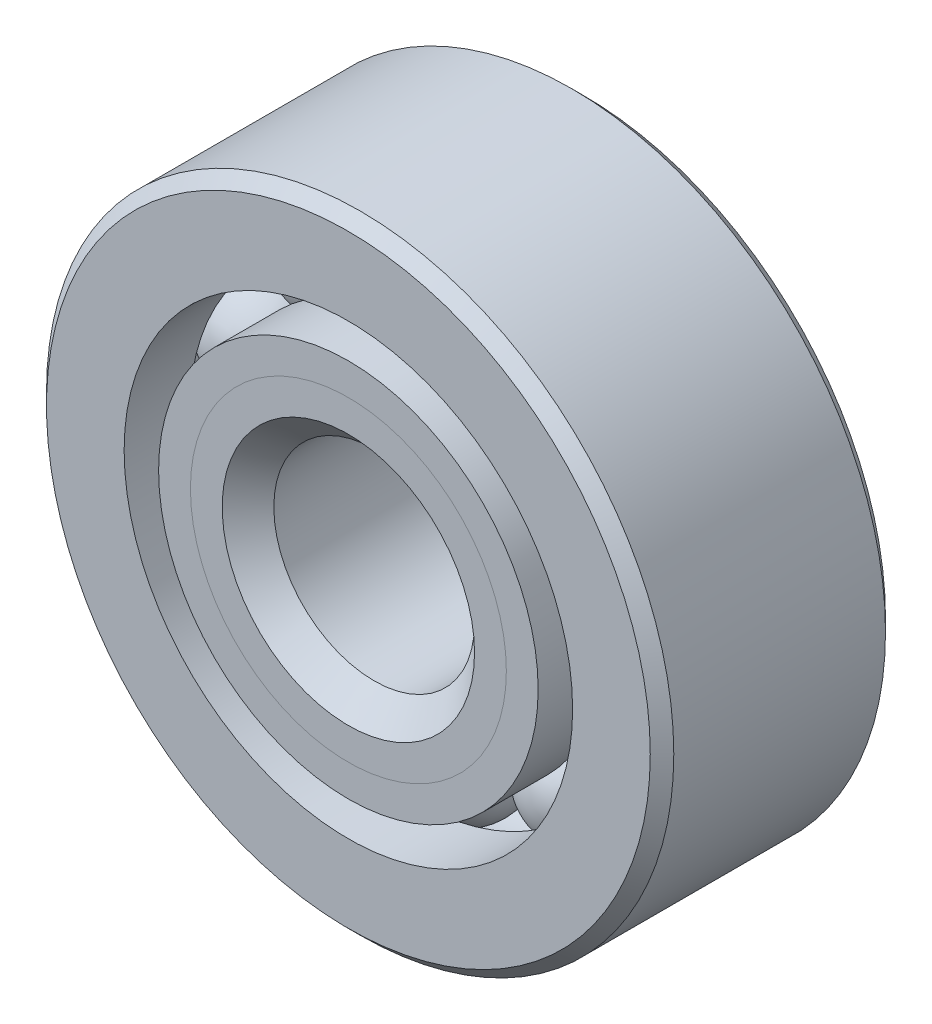
ISO-10303-21;
HEADER;
FILE_DESCRIPTION(('STEP AP214'),'2;1');
FILE_NAME('part.step','',(''),(''),'','','');
FILE_SCHEMA(('AUTOMOTIVE_DESIGN { 1 0 10303 214 1 1 1 1 }'));
ENDSEC;
DATA;
#1=APPLICATION_CONTEXT('core data for automotive mechanical design processes');
#2=APPLICATION_PROTOCOL_DEFINITION('international standard','automotive_design',2000,#1);
#3=PRODUCT_CONTEXT('',#1,'mechanical');
#4=PRODUCT('Part','Part','',(#3));
#5=PRODUCT_RELATED_PRODUCT_CATEGORY('part','',(#4));
#6=PRODUCT_DEFINITION_FORMATION('','',#4);
#7=PRODUCT_DEFINITION_CONTEXT('part definition',#1,'design');
#8=PRODUCT_DEFINITION('design','',#6,#7);
#9=PRODUCT_DEFINITION_SHAPE('','',#8);
#10=(LENGTH_UNIT() NAMED_UNIT(*) SI_UNIT(.MILLI.,.METRE.));
#11=(NAMED_UNIT(*) PLANE_ANGLE_UNIT() SI_UNIT($,.RADIAN.));
#12=(NAMED_UNIT(*) SI_UNIT($,.STERADIAN.) SOLID_ANGLE_UNIT());
#13=UNCERTAINTY_MEASURE_WITH_UNIT(LENGTH_MEASURE(1.E-05),#10,'distance_accuracy_value','');
#14=(GEOMETRIC_REPRESENTATION_CONTEXT(3) GLOBAL_UNCERTAINTY_ASSIGNED_CONTEXT((#13)) GLOBAL_UNIT_ASSIGNED_CONTEXT((#10,
#11,#12)) REPRESENTATION_CONTEXT('',''));
#15=CARTESIAN_POINT('',(0.,0.,0.));
#16=DIRECTION('',(0.,0.,1.));
#17=DIRECTION('',(1.,0.,0.));
#18=AXIS2_PLACEMENT_3D('',#15,#16,#17);
#19=CARTESIAN_POINT('',(-0.615851998089428,0.847647555856359,0.));
#20=DIRECTION('',(0.,0.,1.));
#21=DIRECTION('',(-0.587785252292462,0.809016994374955,0.));
#22=AXIS2_PLACEMENT_3D('',#19,#20,#21);
#23=SPHERICAL_SURFACE('',#22,0.278590360257991);
#24=CARTESIAN_POINT('',(-0.615851998089428,0.847647555856359,0.27859036025799));
#25=VERTEX_POINT('',#24);
#26=VERTEX_LOOP('',#25);
#27=FACE_BOUND('',#26,.T.);
#28=ADVANCED_FACE('F54',(#27),#23,.T.);
#29=CLOSED_SHELL('',(#28));
#30=MANIFOLD_SOLID_BREP('B2',#29);
#31=CARTESIAN_POINT('',(-0.996469464948244,0.323772555856362,0.));
#32=DIRECTION('',(0.,0.,1.));
#33=DIRECTION('',(-0.95105651629515,0.309016994374958,0.));
#34=AXIS2_PLACEMENT_3D('',#31,#32,#33);
#35=SPHERICAL_SURFACE('',#34,0.278590360257991);
#36=CARTESIAN_POINT('',(-0.996469464948244,0.323772555856362,0.27859036025799));
#37=VERTEX_POINT('',#36);
#38=VERTEX_LOOP('',#37);
#39=FACE_BOUND('',#38,.T.);
#40=ADVANCED_FACE('F94',(#39),#35,.T.);
#41=CLOSED_SHELL('',(#40));
#42=MANIFOLD_SOLID_BREP('B6',#41);
#43=CARTESIAN_POINT('',(-0.99646946494825,-0.323772555856342,0.));
#44=DIRECTION('',(0.,0.,1.));
#45=DIRECTION('',(-0.951056516295157,-0.309016994374938,0.));
#46=AXIS2_PLACEMENT_3D('',#43,#44,#45);
#47=SPHERICAL_SURFACE('',#46,0.278590360257991);
#48=CARTESIAN_POINT('',(-0.99646946494825,-0.323772555856342,0.27859036025799));
#49=VERTEX_POINT('',#48);
#50=VERTEX_LOOP('',#49);
#51=FACE_BOUND('',#50,.T.);
#52=ADVANCED_FACE('F134',(#51),#47,.T.);
#53=CLOSED_SHELL('',(#52));
#54=MANIFOLD_SOLID_BREP('B50',#53);
#55=CARTESIAN_POINT('',(-0.615851998089446,-0.847647555856346,0.));
#56=DIRECTION('',(0.,0.,1.));
#57=DIRECTION('',(-0.58778525229248,-0.809016994374942,0.));
#58=AXIS2_PLACEMENT_3D('',#55,#56,#57);
#59=SPHERICAL_SURFACE('',#58,0.278590360257991);
#60=CARTESIAN_POINT('',(-0.615851998089446,-0.847647555856346,0.27859036025799));
#61=VERTEX_POINT('',#60);
#62=VERTEX_LOOP('',#61);
#63=FACE_BOUND('',#62,.T.);
#64=ADVANCED_FACE('F174',(#63),#59,.T.);
#65=CLOSED_SHELL('',(#64));
#66=MANIFOLD_SOLID_BREP('B90',#65);
#67=CARTESIAN_POINT('',(0.,-1.04775,0.));
#68=DIRECTION('',(0.,0.,1.));
#69=DIRECTION('',(0.,-1.,0.));
#70=AXIS2_PLACEMENT_3D('',#67,#68,#69);
#71=SPHERICAL_SURFACE('',#70,0.278590360257991);
#72=CARTESIAN_POINT('',(0.,-1.04775,0.27859036025799));
#73=VERTEX_POINT('',#72);
#74=VERTEX_LOOP('',#73);
#75=FACE_BOUND('',#74,.T.);
#76=ADVANCED_FACE('F214',(#75),#71,.T.);
#77=CLOSED_SHELL('',(#76));
#78=MANIFOLD_SOLID_BREP('B130',#77);
#79=CARTESIAN_POINT('',(0.615851998089434,-0.847647555856355,0.));
#80=DIRECTION('',(0.,0.,1.));
#81=DIRECTION('',(0.587785252292469,-0.809016994374951,0.));
#82=AXIS2_PLACEMENT_3D('',#79,#80,#81);
#83=SPHERICAL_SURFACE('',#82,0.278590360257991);
#84=CARTESIAN_POINT('',(0.615851998089434,-0.847647555856355,0.27859036025799));
#85=VERTEX_POINT('',#84);
#86=VERTEX_LOOP('',#85);
#87=FACE_BOUND('',#86,.T.);
#88=ADVANCED_FACE('F254',(#87),#83,.T.);
#89=CLOSED_SHELL('',(#88));
#90=MANIFOLD_SOLID_BREP('B170',#89);
#91=CARTESIAN_POINT('',(0.996469464948246,-0.323772555856356,0.));
#92=DIRECTION('',(0.,0.,1.));
#93=DIRECTION('',(0.951056516295152,-0.309016994374952,0.));
#94=AXIS2_PLACEMENT_3D('',#91,#92,#93);
#95=SPHERICAL_SURFACE('',#94,0.278590360257991);
#96=CARTESIAN_POINT('',(0.996469464948246,-0.323772555856356,0.27859036025799));
#97=VERTEX_POINT('',#96);
#98=VERTEX_LOOP('',#97);
#99=FACE_BOUND('',#98,.T.);
#100=ADVANCED_FACE('F294',(#99),#95,.T.);
#101=CLOSED_SHELL('',(#100));
#102=MANIFOLD_SOLID_BREP('B210',#101);
#103=CARTESIAN_POINT('',(0.996469464948248,0.323772555856348,0.));
#104=DIRECTION('',(0.,0.,1.));
#105=DIRECTION('',(0.951056516295155,0.309016994374945,0.));
#106=AXIS2_PLACEMENT_3D('',#103,#104,#105);
#107=SPHERICAL_SURFACE('',#106,0.278590360257991);
#108=CARTESIAN_POINT('',(0.996469464948248,0.323772555856348,0.27859036025799));
#109=VERTEX_POINT('',#108);
#110=VERTEX_LOOP('',#109);
#111=FACE_BOUND('',#110,.T.);
#112=ADVANCED_FACE('F334',(#111),#107,.T.);
#113=CLOSED_SHELL('',(#112));
#114=MANIFOLD_SOLID_BREP('B250',#113);
#115=CARTESIAN_POINT('',(0.61585199808944,0.847647555856351,0.));
#116=DIRECTION('',(0.,0.,1.));
#117=DIRECTION('',(0.587785252292474,0.809016994374947,0.));
#118=AXIS2_PLACEMENT_3D('',#115,#116,#117);
#119=SPHERICAL_SURFACE('',#118,0.278590360257991);
#120=CARTESIAN_POINT('',(0.61585199808944,0.847647555856351,0.27859036025799));
#121=VERTEX_POINT('',#120);
#122=VERTEX_LOOP('',#121);
#123=FACE_BOUND('',#122,.T.);
#124=ADVANCED_FACE('F374',(#123),#119,.T.);
#125=CLOSED_SHELL('',(#124));
#126=MANIFOLD_SOLID_BREP('B290',#125);
#127=CARTESIAN_POINT('',(0.,1.04775,0.));
#128=DIRECTION('',(0.,0.,1.));
#129=DIRECTION('',(0.,1.,0.));
#130=AXIS2_PLACEMENT_3D('',#127,#128,#129);
#131=SPHERICAL_SURFACE('',#130,0.278590360257991);
#132=CARTESIAN_POINT('',(0.,1.04775,0.27859036025799));
#133=VERTEX_POINT('',#132);
#134=VERTEX_LOOP('',#133);
#135=FACE_BOUND('',#134,.T.);
#136=ADVANCED_FACE('F416',(#135),#131,.T.);
#137=CLOSED_SHELL('',(#136));
#138=MANIFOLD_SOLID_BREP('B330',#137);
#139=CARTESIAN_POINT('',(0.,0.799552272572866,0.5953125));
#140=DIRECTION('',(0.,0.,-1.));
#141=DIRECTION('',(-1.,0.,0.));
#142=AXIS2_PLACEMENT_3D('',#139,#140,#141);
#143=PLANE('',#142);
#144=CARTESIAN_POINT('',(0.,0.,0.5953125));
#145=DIRECTION('',(0.,0.,1.));
#146=DIRECTION('',(1.,0.,0.));
#147=AXIS2_PLACEMENT_3D('',#144,#145,#146);
#148=CIRCLE('',#147,0.638579819871005);
#149=CARTESIAN_POINT('',(0.638579819871005,0.,0.5953125));
#150=VERTEX_POINT('',#149);
#151=EDGE_CURVE('E482',#150,#150,#148,.T.);
#152=ORIENTED_EDGE('',*,*,#151,.F.);
#153=EDGE_LOOP('',(#152));
#154=FACE_BOUND('',#153,.T.);
#155=CARTESIAN_POINT('',(0.,0.,0.5953125));
#156=DIRECTION('',(0.,0.,1.));
#157=DIRECTION('',(1.,0.,0.));
#158=AXIS2_PLACEMENT_3D('',#155,#156,#157);
#159=CIRCLE('',#158,0.799552272572866);
#160=CARTESIAN_POINT('',(0.799552272572866,0.,0.5953125));
#161=VERTEX_POINT('',#160);
#162=EDGE_CURVE('E415',#161,#161,#159,.T.);
#163=ORIENTED_EDGE('',*,*,#162,.T.);
#164=EDGE_LOOP('',(#163));
#165=FACE_BOUND('',#164,.T.);
#166=ADVANCED_FACE('F437',(#154,#165),#143,.F.);
#167=CARTESIAN_POINT('',(0.,0.,0.43434004729814));
#168=DIRECTION('',(0.,0.,1.));
#169=DIRECTION('',(1.,0.,0.));
#170=AXIS2_PLACEMENT_3D('',#167,#168,#169);
#171=CONICAL_SURFACE('',#170,0.638579819871005,0.78539816339745);
#172=ORIENTED_EDGE('',*,*,#162,.F.);
#173=EDGE_LOOP('',(#172));
#174=FACE_BOUND('',#173,.T.);
#175=CARTESIAN_POINT('',(0.,0.,0.43434004729814));
#176=DIRECTION('',(0.,0.,1.));
#177=DIRECTION('',(1.,0.,0.));
#178=AXIS2_PLACEMENT_3D('',#175,#176,#177);
#179=CIRCLE('',#178,0.638579819871005);
#180=CARTESIAN_POINT('',(0.638579819871005,0.,0.43434004729814));
#181=VERTEX_POINT('',#180);
#182=EDGE_CURVE('E444',#181,#181,#179,.T.);
#183=ORIENTED_EDGE('',*,*,#182,.T.);
#184=EDGE_LOOP('',(#183));
#185=FACE_BOUND('',#184,.T.);
#186=ADVANCED_FACE('F491',(#174,#185),#171,.T.);
#187=CARTESIAN_POINT('',(0.,0.,0.5953125));
#188=DIRECTION('',(0.,0.,1.));
#189=DIRECTION('',(1.,0.,0.));
#190=AXIS2_PLACEMENT_3D('',#187,#188,#189);
#191=CYLINDRICAL_SURFACE('',#190,0.638579819871005);
#192=ORIENTED_EDGE('',*,*,#182,.F.);
#193=EDGE_LOOP('',(#192));
#194=FACE_BOUND('',#193,.T.);
#195=CARTESIAN_POINT('',(0.,0.,0.));
#196=DIRECTION('',(0.,0.,1.));
#197=DIRECTION('',(1.,0.,0.));
#198=AXIS2_PLACEMENT_3D('',#195,#196,#197);
#199=CIRCLE('',#198,0.638579819871005);
#200=CARTESIAN_POINT('',(0.638579819871005,0.,0.));
#201=VERTEX_POINT('',#200);
#202=EDGE_CURVE('E450',#201,#201,#199,.T.);
#203=ORIENTED_EDGE('',*,*,#202,.T.);
#204=EDGE_LOOP('',(#203));
#205=FACE_BOUND('',#204,.T.);
#206=ADVANCED_FACE('F495',(#194,#205),#191,.T.);
#207=CARTESIAN_POINT('',(0.,0.638579819871005,0.));
#208=DIRECTION('',(0.,0.,-1.));
#209=DIRECTION('',(-1.,0.,0.));
#210=AXIS2_PLACEMENT_3D('',#207,#208,#209);
#211=PLANE('',#210);
#212=ORIENTED_EDGE('',*,*,#202,.F.);
#213=EDGE_LOOP('',(#212));
#214=FACE_BOUND('',#213,.T.);
#215=CARTESIAN_POINT('',(0.,0.,0.));
#216=DIRECTION('',(0.,0.,1.));
#217=DIRECTION('',(1.,0.,0.));
#218=AXIS2_PLACEMENT_3D('',#215,#216,#217);
#219=CIRCLE('',#218,0.769159639742009);
#220=CARTESIAN_POINT('',(0.769159639742009,0.,0.));
#221=VERTEX_POINT('',#220);
#222=EDGE_CURVE('E456',#221,#221,#219,.T.);
#223=ORIENTED_EDGE('',*,*,#222,.T.);
#224=EDGE_LOOP('',(#223));
#225=FACE_BOUND('',#224,.T.);
#226=ADVANCED_FACE('F500',(#214,#225),#211,.F.);
#227=CARTESIAN_POINT('',(0.,0.,0.));
#228=DIRECTION('',(0.,0.,1.));
#229=DIRECTION('',(1.,0.,0.));
#230=AXIS2_PLACEMENT_3D('',#227,#228,#229);
#231=TOROIDAL_SURFACE('',#230,1.04775,0.27859036025799);
#232=ORIENTED_EDGE('',*,*,#222,.F.);
#233=EDGE_LOOP('',(#232));
#234=FACE_BOUND('',#233,.T.);
#235=CARTESIAN_POINT('',(0.,0.,-0.264583333333333));
#236=DIRECTION('',(0.,0.,1.));
#237=DIRECTION('',(1.,0.,0.));
#238=AXIS2_PLACEMENT_3D('',#235,#236,#237);
#239=CIRCLE('',#238,0.960524725274726);
#240=CARTESIAN_POINT('',(0.960524725274726,0.,-0.264583333333333));
#241=VERTEX_POINT('',#240);
#242=EDGE_CURVE('E462',#241,#241,#239,.T.);
#243=ORIENTED_EDGE('',*,*,#242,.T.);
#244=EDGE_LOOP('',(#243));
#245=FACE_BOUND('',#244,.T.);
#246=ADVANCED_FACE('F506',(#234,#245),#231,.F.);
#247=CARTESIAN_POINT('',(0.,0.,0.5953125));
#248=DIRECTION('',(0.,0.,1.));
#249=DIRECTION('',(1.,0.,0.));
#250=AXIS2_PLACEMENT_3D('',#247,#248,#249);
#251=CYLINDRICAL_SURFACE('',#250,0.960524725274727);
#252=ORIENTED_EDGE('',*,*,#242,.F.);
#253=EDGE_LOOP('',(#252));
#254=FACE_BOUND('',#253,.T.);
#255=CARTESIAN_POINT('',(0.,0.,-0.595312500000002));
#256=DIRECTION('',(0.,0.,1.));
#257=DIRECTION('',(1.,0.,0.));
#258=AXIS2_PLACEMENT_3D('',#255,#256,#257);
#259=CIRCLE('',#258,0.960524725274727);
#260=CARTESIAN_POINT('',(0.960524725274727,0.,-0.595312500000002));
#261=VERTEX_POINT('',#260);
#262=EDGE_CURVE('E466',#261,#261,#259,.T.);
#263=ORIENTED_EDGE('',*,*,#262,.T.);
#264=EDGE_LOOP('',(#263));
#265=FACE_BOUND('',#264,.T.);
#266=ADVANCED_FACE('F510',(#254,#265),#251,.T.);
#267=CARTESIAN_POINT('',(0.,0.56753125,-0.595312500000002));
#268=DIRECTION('',(0.,0.,1.));
#269=DIRECTION('',(1.,0.,0.));
#270=AXIS2_PLACEMENT_3D('',#267,#268,#269);
#271=PLANE('',#270);
#272=ORIENTED_EDGE('',*,*,#262,.F.);
#273=EDGE_LOOP('',(#272));
#274=FACE_BOUND('',#273,.T.);
#275=CARTESIAN_POINT('',(0.,0.,-0.595312500000002));
#276=DIRECTION('',(0.,0.,1.));
#277=DIRECTION('',(1.,0.,0.));
#278=AXIS2_PLACEMENT_3D('',#275,#276,#277);
#279=CIRCLE('',#278,0.56753125);
#280=CARTESIAN_POINT('',(0.56753125,0.,-0.595312500000002));
#281=VERTEX_POINT('',#280);
#282=EDGE_CURVE('E470',#281,#281,#279,.T.);
#283=ORIENTED_EDGE('',*,*,#282,.T.);
#284=EDGE_LOOP('',(#283));
#285=FACE_BOUND('',#284,.T.);
#286=ADVANCED_FACE('F514',(#274,#285),#271,.F.);
#287=CARTESIAN_POINT('',(0.,0.,-0.535781250000001));
#288=DIRECTION('',(0.,0.,-1.));
#289=DIRECTION('',(-1.,0.,0.));
#290=AXIS2_PLACEMENT_3D('',#287,#288,#289);
#291=CONICAL_SURFACE('',#290,0.508,0.785398163397445);
#292=ORIENTED_EDGE('',*,*,#282,.F.);
#293=EDGE_LOOP('',(#292));
#294=FACE_BOUND('',#293,.T.);
#295=CARTESIAN_POINT('',(0.,0.,-0.535781250000001));
#296=DIRECTION('',(0.,0.,1.));
#297=DIRECTION('',(1.,0.,0.));
#298=AXIS2_PLACEMENT_3D('',#295,#296,#297);
#299=CIRCLE('',#298,0.508);
#300=CARTESIAN_POINT('',(0.508,0.,-0.535781250000001));
#301=VERTEX_POINT('',#300);
#302=EDGE_CURVE('E474',#301,#301,#299,.T.);
#303=ORIENTED_EDGE('',*,*,#302,.T.);
#304=EDGE_LOOP('',(#303));
#305=FACE_BOUND('',#304,.T.);
#306=ADVANCED_FACE('F518',(#294,#305),#291,.F.);
#307=CARTESIAN_POINT('',(0.,0.,0.5953125));
#308=DIRECTION('',(0.,0.,1.));
#309=DIRECTION('',(1.,0.,0.));
#310=AXIS2_PLACEMENT_3D('',#307,#308,#309);
#311=CYLINDRICAL_SURFACE('',#310,0.508);
#312=ORIENTED_EDGE('',*,*,#302,.F.);
#313=EDGE_LOOP('',(#312));
#314=FACE_BOUND('',#313,.T.);
#315=CARTESIAN_POINT('',(0.,0.,0.464732680128996));
#316=DIRECTION('',(0.,0.,1.));
#317=DIRECTION('',(1.,0.,0.));
#318=AXIS2_PLACEMENT_3D('',#315,#316,#317);
#319=CIRCLE('',#318,0.508);
#320=CARTESIAN_POINT('',(0.508,0.,0.464732680128996));
#321=VERTEX_POINT('',#320);
#322=EDGE_CURVE('E478',#321,#321,#319,.T.);
#323=ORIENTED_EDGE('',*,*,#322,.T.);
#324=EDGE_LOOP('',(#323));
#325=FACE_BOUND('',#324,.T.);
#326=ADVANCED_FACE('F522',(#314,#325),#311,.F.);
#327=CARTESIAN_POINT('',(0.,0.,0.5953125));
#328=DIRECTION('',(0.,0.,1.));
#329=DIRECTION('',(1.,0.,0.));
#330=AXIS2_PLACEMENT_3D('',#327,#328,#329);
#331=CONICAL_SURFACE('',#330,0.638579819871005,0.785398163397451);
#332=ORIENTED_EDGE('',*,*,#322,.F.);
#333=EDGE_LOOP('',(#332));
#334=FACE_BOUND('',#333,.T.);
#335=ORIENTED_EDGE('',*,*,#151,.T.);
#336=EDGE_LOOP('',(#335));
#337=FACE_BOUND('',#336,.T.);
#338=ADVANCED_FACE('F488',(#334,#337),#331,.F.);
#339=CLOSED_SHELL('',(#166,#186,#206,#226,#246,#266,#286,#306,#326,#338));
#340=MANIFOLD_SOLID_BREP('B370',#339);
#341=CARTESIAN_POINT('',(0.,0.960524725274726,0.5953125));
#342=DIRECTION('',(0.,0.,-1.));
#343=DIRECTION('',(-1.,0.,0.));
#344=AXIS2_PLACEMENT_3D('',#341,#342,#343);
#345=PLANE('',#344);
#346=CARTESIAN_POINT('',(0.,0.,0.5953125));
#347=DIRECTION('',(0.,0.,1.));
#348=DIRECTION('',(1.,0.,0.));
#349=AXIS2_PLACEMENT_3D('',#346,#347,#348);
#350=CIRCLE('',#349,0.799552272572866);
#351=CARTESIAN_POINT('',(0.799552272572866,0.,0.5953125));
#352=VERTEX_POINT('',#351);
#353=EDGE_CURVE('E436',#352,#352,#350,.T.);
#354=ORIENTED_EDGE('',*,*,#353,.F.);
#355=EDGE_LOOP('',(#354));
#356=FACE_BOUND('',#355,.T.);
#357=CARTESIAN_POINT('',(0.,0.,0.5953125));
#358=DIRECTION('',(0.,0.,1.));
#359=DIRECTION('',(1.,0.,0.));
#360=AXIS2_PLACEMENT_3D('',#357,#358,#359);
#361=CIRCLE('',#360,0.960524725274726);
#362=CARTESIAN_POINT('',(0.960524725274726,0.,0.5953125));
#363=VERTEX_POINT('',#362);
#364=EDGE_CURVE('E645',#363,#363,#361,.T.);
#365=ORIENTED_EDGE('',*,*,#364,.T.);
#366=EDGE_LOOP('',(#365));
#367=FACE_BOUND('',#366,.T.);
#368=ADVANCED_FACE('F616',(#356,#367),#345,.F.);
#369=CARTESIAN_POINT('',(0.,0.,0.5953125));
#370=DIRECTION('',(0.,0.,1.));
#371=DIRECTION('',(1.,0.,0.));
#372=AXIS2_PLACEMENT_3D('',#369,#370,#371);
#373=CONICAL_SURFACE('',#372,0.799552272572866,0.78539816339745);
#374=CARTESIAN_POINT('',(0.,0.,0.43434004729814));
#375=DIRECTION('',(0.,0.,1.));
#376=DIRECTION('',(1.,0.,0.));
#377=AXIS2_PLACEMENT_3D('',#374,#375,#376);
#378=CIRCLE('',#377,0.638579819871005);
#379=CARTESIAN_POINT('',(0.638579819871005,0.,0.43434004729814));
#380=VERTEX_POINT('',#379);
#381=EDGE_CURVE('E623',#380,#380,#378,.T.);
#382=ORIENTED_EDGE('',*,*,#381,.F.);
#383=EDGE_LOOP('',(#382));
#384=FACE_BOUND('',#383,.T.);
#385=ORIENTED_EDGE('',*,*,#353,.T.);
#386=EDGE_LOOP('',(#385));
#387=FACE_BOUND('',#386,.T.);
#388=ADVANCED_FACE('F672',(#384,#387),#373,.F.);
#389=CARTESIAN_POINT('',(0.,0.,0.5953125));
#390=DIRECTION('',(0.,0.,1.));
#391=DIRECTION('',(1.,0.,0.));
#392=AXIS2_PLACEMENT_3D('',#389,#390,#391);
#393=CYLINDRICAL_SURFACE('',#392,0.638579819871005);
#394=CARTESIAN_POINT('',(0.,0.,0.));
#395=DIRECTION('',(0.,0.,1.));
#396=DIRECTION('',(1.,0.,0.));
#397=AXIS2_PLACEMENT_3D('',#394,#395,#396);
#398=CIRCLE('',#397,0.638579819871005);
#399=CARTESIAN_POINT('',(0.638579819871005,0.,0.));
#400=VERTEX_POINT('',#399);
#401=EDGE_CURVE('E629',#400,#400,#398,.T.);
#402=ORIENTED_EDGE('',*,*,#401,.F.);
#403=EDGE_LOOP('',(#402));
#404=FACE_BOUND('',#403,.T.);
#405=ORIENTED_EDGE('',*,*,#381,.T.);
#406=EDGE_LOOP('',(#405));
#407=FACE_BOUND('',#406,.T.);
#408=ADVANCED_FACE('F667',(#404,#407),#393,.F.);
#409=CARTESIAN_POINT('',(0.,0.638579819871005,0.));
#410=DIRECTION('',(0.,0.,1.));
#411=DIRECTION('',(1.,0.,0.));
#412=AXIS2_PLACEMENT_3D('',#409,#410,#411);
#413=PLANE('',#412);
#414=CARTESIAN_POINT('',(0.,0.,0.));
#415=DIRECTION('',(0.,0.,1.));
#416=DIRECTION('',(1.,0.,0.));
#417=AXIS2_PLACEMENT_3D('',#414,#415,#416);
#418=CIRCLE('',#417,0.769159639742009);
#419=CARTESIAN_POINT('',(0.769159639742009,0.,0.));
#420=VERTEX_POINT('',#419);
#421=EDGE_CURVE('E635',#420,#420,#418,.T.);
#422=ORIENTED_EDGE('',*,*,#421,.F.);
#423=EDGE_LOOP('',(#422));
#424=FACE_BOUND('',#423,.T.);
#425=ORIENTED_EDGE('',*,*,#401,.T.);
#426=EDGE_LOOP('',(#425));
#427=FACE_BOUND('',#426,.T.);
#428=ADVANCED_FACE('F661',(#424,#427),#413,.F.);
#429=CARTESIAN_POINT('',(0.,0.,0.));
#430=DIRECTION('',(0.,0.,1.));
#431=DIRECTION('',(1.,0.,0.));
#432=AXIS2_PLACEMENT_3D('',#429,#430,#431);
#433=TOROIDAL_SURFACE('',#432,1.04775,0.278590360257991);
#434=CARTESIAN_POINT('',(0.,0.,0.264583333333333));
#435=DIRECTION('',(0.,0.,1.));
#436=DIRECTION('',(1.,0.,0.));
#437=AXIS2_PLACEMENT_3D('',#434,#435,#436);
#438=CIRCLE('',#437,0.960524725274726);
#439=CARTESIAN_POINT('',(0.960524725274726,0.,0.264583333333333));
#440=VERTEX_POINT('',#439);
#441=EDGE_CURVE('E641',#440,#440,#438,.T.);
#442=ORIENTED_EDGE('',*,*,#441,.F.);
#443=EDGE_LOOP('',(#442));
#444=FACE_BOUND('',#443,.T.);
#445=ORIENTED_EDGE('',*,*,#421,.T.);
#446=EDGE_LOOP('',(#445));
#447=FACE_BOUND('',#446,.T.);
#448=ADVANCED_FACE('F655',(#444,#447),#433,.F.);
#449=CARTESIAN_POINT('',(0.,0.,0.5953125));
#450=DIRECTION('',(0.,0.,1.));
#451=DIRECTION('',(1.,0.,0.));
#452=AXIS2_PLACEMENT_3D('',#449,#450,#451);
#453=CYLINDRICAL_SURFACE('',#452,0.960524725274726);
#454=ORIENTED_EDGE('',*,*,#364,.F.);
#455=EDGE_LOOP('',(#454));
#456=FACE_BOUND('',#455,.T.);
#457=ORIENTED_EDGE('',*,*,#441,.T.);
#458=EDGE_LOOP('',(#457));
#459=FACE_BOUND('',#458,.T.);
#460=ADVANCED_FACE('F652',(#456,#459),#453,.T.);
#461=CLOSED_SHELL('',(#368,#388,#408,#428,#448,#460));
#462=MANIFOLD_SOLID_BREP('B410',#461);
#463=CARTESIAN_POINT('',(0.,0.,0.53578125));
#464=DIRECTION('',(0.,0.,-1.));
#465=DIRECTION('',(-1.,0.,0.));
#466=AXIS2_PLACEMENT_3D('',#463,#464,#465);
#467=CONICAL_SURFACE('',#466,1.5875,0.785398163397452);
#468=CARTESIAN_POINT('',(0.,0.,0.5953125));
#469=DIRECTION('',(0.,0.,1.));
#470=DIRECTION('',(1.,0.,0.));
#471=AXIS2_PLACEMENT_3D('',#468,#469,#470);
#472=CIRCLE('',#471,1.52796875);
#473=CARTESIAN_POINT('',(1.52796875,0.,0.5953125));
#474=VERTEX_POINT('',#473);
#475=EDGE_CURVE('E757',#474,#474,#472,.T.);
#476=ORIENTED_EDGE('',*,*,#475,.F.);
#477=EDGE_LOOP('',(#476));
#478=FACE_BOUND('',#477,.T.);
#479=CARTESIAN_POINT('',(0.,0.,0.53578125));
#480=DIRECTION('',(0.,0.,1.));
#481=DIRECTION('',(1.,0.,0.));
#482=AXIS2_PLACEMENT_3D('',#479,#480,#481);
#483=CIRCLE('',#482,1.5875);
#484=CARTESIAN_POINT('',(1.5875,0.,0.53578125));
#485=VERTEX_POINT('',#484);
#486=EDGE_CURVE('E615',#485,#485,#483,.T.);
#487=ORIENTED_EDGE('',*,*,#486,.T.);
#488=EDGE_LOOP('',(#487));
#489=FACE_BOUND('',#488,.T.);
#490=ADVANCED_FACE('F720',(#478,#489),#467,.T.);
#491=CARTESIAN_POINT('',(0.,0.,0.5953125));
#492=DIRECTION('',(0.,0.,1.));
#493=DIRECTION('',(1.,0.,0.));
#494=AXIS2_PLACEMENT_3D('',#491,#492,#493);
#495=CYLINDRICAL_SURFACE('',#494,1.5875);
#496=ORIENTED_EDGE('',*,*,#486,.F.);
#497=EDGE_LOOP('',(#496));
#498=FACE_BOUND('',#497,.T.);
#499=CARTESIAN_POINT('',(0.,0.,-0.535781250000001));
#500=DIRECTION('',(0.,0.,1.));
#501=DIRECTION('',(1.,0.,0.));
#502=AXIS2_PLACEMENT_3D('',#499,#500,#501);
#503=CIRCLE('',#502,1.5875);
#504=CARTESIAN_POINT('',(1.5875,0.,-0.535781250000001));
#505=VERTEX_POINT('',#504);
#506=EDGE_CURVE('E727',#505,#505,#503,.T.);
#507=ORIENTED_EDGE('',*,*,#506,.T.);
#508=EDGE_LOOP('',(#507));
#509=FACE_BOUND('',#508,.T.);
#510=ADVANCED_FACE('F766',(#498,#509),#495,.T.);
#511=CARTESIAN_POINT('',(0.,0.,-0.595312500000001));
#512=DIRECTION('',(0.,0.,1.));
#513=DIRECTION('',(1.,0.,0.));
#514=AXIS2_PLACEMENT_3D('',#511,#512,#513);
#515=CONICAL_SURFACE('',#514,1.52796875,0.785398163397452);
#516=ORIENTED_EDGE('',*,*,#506,.F.);
#517=EDGE_LOOP('',(#516));
#518=FACE_BOUND('',#517,.T.);
#519=CARTESIAN_POINT('',(0.,0.,-0.595312500000001));
#520=DIRECTION('',(0.,0.,1.));
#521=DIRECTION('',(1.,0.,0.));
#522=AXIS2_PLACEMENT_3D('',#519,#520,#521);
#523=CIRCLE('',#522,1.52796875);
#524=CARTESIAN_POINT('',(1.52796875,0.,-0.595312500000001));
#525=VERTEX_POINT('',#524);
#526=EDGE_CURVE('E733',#525,#525,#523,.T.);
#527=ORIENTED_EDGE('',*,*,#526,.T.);
#528=EDGE_LOOP('',(#527));
#529=FACE_BOUND('',#528,.T.);
#530=ADVANCED_FACE('F769',(#518,#529),#515,.T.);
#531=CARTESIAN_POINT('',(0.,1.52796875,-0.595312500000002));
#532=DIRECTION('',(0.,0.,1.));
#533=DIRECTION('',(1.,0.,0.));
#534=AXIS2_PLACEMENT_3D('',#531,#532,#533);
#535=PLANE('',#534);
#536=ORIENTED_EDGE('',*,*,#526,.F.);
#537=EDGE_LOOP('',(#536));
#538=FACE_BOUND('',#537,.T.);
#539=CARTESIAN_POINT('',(0.,0.,-0.595312500000002));
#540=DIRECTION('',(0.,0.,1.));
#541=DIRECTION('',(1.,0.,0.));
#542=AXIS2_PLACEMENT_3D('',#539,#540,#541);
#543=CIRCLE('',#542,1.13497527472527);
#544=CARTESIAN_POINT('',(1.13497527472527,0.,-0.595312500000002));
#545=VERTEX_POINT('',#544);
#546=EDGE_CURVE('E739',#545,#545,#543,.T.);
#547=ORIENTED_EDGE('',*,*,#546,.T.);
#548=EDGE_LOOP('',(#547));
#549=FACE_BOUND('',#548,.T.);
#550=ADVANCED_FACE('F773',(#538,#549),#535,.F.);
#551=CARTESIAN_POINT('',(0.,0.,0.5953125));
#552=DIRECTION('',(0.,0.,1.));
#553=DIRECTION('',(1.,0.,0.));
#554=AXIS2_PLACEMENT_3D('',#551,#552,#553);
#555=CYLINDRICAL_SURFACE('',#554,1.13497527472527);
#556=ORIENTED_EDGE('',*,*,#546,.F.);
#557=EDGE_LOOP('',(#556));
#558=FACE_BOUND('',#557,.T.);
#559=CARTESIAN_POINT('',(0.,0.,-0.264583333333334));
#560=DIRECTION('',(0.,0.,1.));
#561=DIRECTION('',(1.,0.,0.));
#562=AXIS2_PLACEMENT_3D('',#559,#560,#561);
#563=CIRCLE('',#562,1.13497527472527);
#564=CARTESIAN_POINT('',(1.13497527472527,0.,-0.264583333333334));
#565=VERTEX_POINT('',#564);
#566=EDGE_CURVE('E745',#565,#565,#563,.T.);
#567=ORIENTED_EDGE('',*,*,#566,.T.);
#568=EDGE_LOOP('',(#567));
#569=FACE_BOUND('',#568,.T.);
#570=ADVANCED_FACE('F779',(#558,#569),#555,.F.);
#571=CARTESIAN_POINT('',(0.,0.,0.));
#572=DIRECTION('',(0.,0.,1.));
#573=DIRECTION('',(1.,0.,0.));
#574=AXIS2_PLACEMENT_3D('',#571,#572,#573);
#575=TOROIDAL_SURFACE('',#574,1.04775,0.278590360257991);
#576=ORIENTED_EDGE('',*,*,#566,.F.);
#577=EDGE_LOOP('',(#576));
#578=FACE_BOUND('',#577,.T.);
#579=CARTESIAN_POINT('',(0.,0.,0.264583333333333));
#580=DIRECTION('',(0.,0.,1.));
#581=DIRECTION('',(1.,0.,0.));
#582=AXIS2_PLACEMENT_3D('',#579,#580,#581);
#583=CIRCLE('',#582,1.13497527472527);
#584=CARTESIAN_POINT('',(1.13497527472527,0.,0.264583333333333));
#585=VERTEX_POINT('',#584);
#586=EDGE_CURVE('E749',#585,#585,#583,.T.);
#587=ORIENTED_EDGE('',*,*,#586,.T.);
#588=EDGE_LOOP('',(#587));
#589=FACE_BOUND('',#588,.T.);
#590=ADVANCED_FACE('F783',(#578,#589),#575,.F.);
#591=CARTESIAN_POINT('',(0.,0.,0.5953125));
#592=DIRECTION('',(0.,0.,1.));
#593=DIRECTION('',(1.,0.,0.));
#594=AXIS2_PLACEMENT_3D('',#591,#592,#593);
#595=CYLINDRICAL_SURFACE('',#594,1.13497527472527);
#596=ORIENTED_EDGE('',*,*,#586,.F.);
#597=EDGE_LOOP('',(#596));
#598=FACE_BOUND('',#597,.T.);
#599=CARTESIAN_POINT('',(0.,0.,0.5953125));
#600=DIRECTION('',(0.,0.,1.));
#601=DIRECTION('',(1.,0.,0.));
#602=AXIS2_PLACEMENT_3D('',#599,#600,#601);
#603=CIRCLE('',#602,1.13497527472527);
#604=CARTESIAN_POINT('',(1.13497527472527,0.,0.5953125));
#605=VERTEX_POINT('',#604);
#606=EDGE_CURVE('E753',#605,#605,#603,.T.);
#607=ORIENTED_EDGE('',*,*,#606,.T.);
#608=EDGE_LOOP('',(#607));
#609=FACE_BOUND('',#608,.T.);
#610=ADVANCED_FACE('F787',(#598,#609),#595,.F.);
#611=CARTESIAN_POINT('',(0.,1.52796875,0.5953125));
#612=DIRECTION('',(0.,0.,-1.));
#613=DIRECTION('',(-1.,0.,0.));
#614=AXIS2_PLACEMENT_3D('',#611,#612,#613);
#615=PLANE('',#614);
#616=ORIENTED_EDGE('',*,*,#606,.F.);
#617=EDGE_LOOP('',(#616));
#618=FACE_BOUND('',#617,.T.);
#619=ORIENTED_EDGE('',*,*,#475,.T.);
#620=EDGE_LOOP('',(#619));
#621=FACE_BOUND('',#620,.T.);
#622=ADVANCED_FACE('F763',(#618,#621),#615,.F.);
#623=CLOSED_SHELL('',(#490,#510,#530,#550,#570,#590,#610,#622));
#624=MANIFOLD_SOLID_BREP('B431',#623);
#625=ADVANCED_BREP_SHAPE_REPRESENTATION('',(#18,#30,#42,#54,#66,#78,#90,#102,#114,#126,#138,
#340,#462,#624),#14);
#626=SHAPE_DEFINITION_REPRESENTATION(#9,#625);
ENDSEC;
END-ISO-10303-21;
